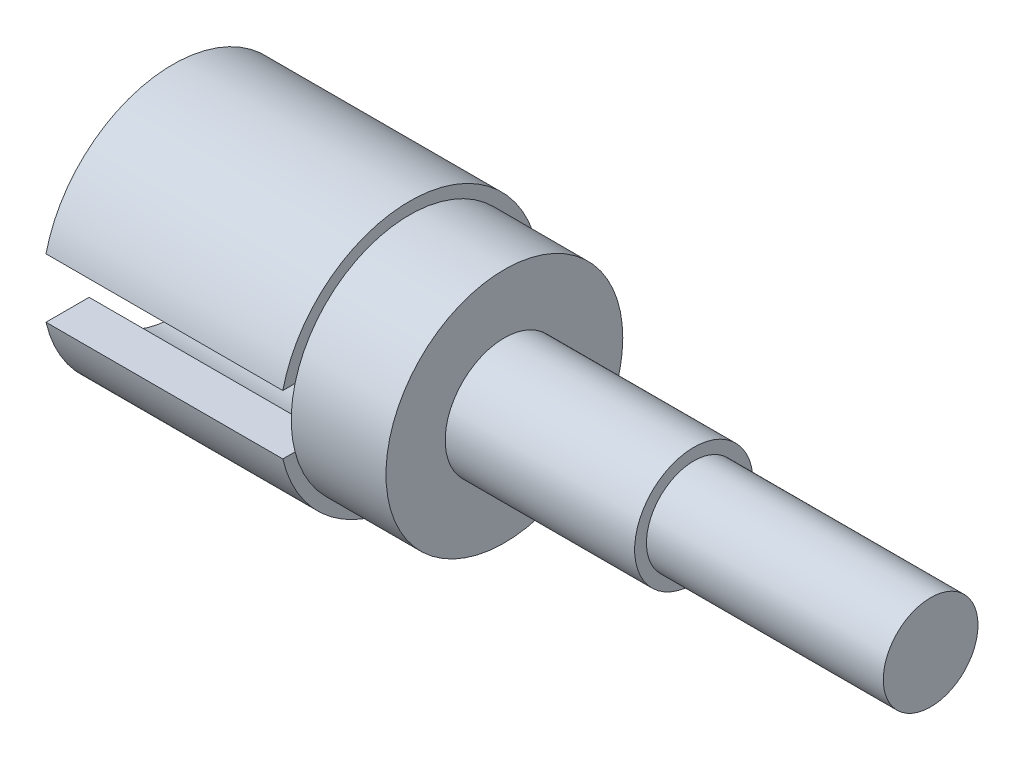
ISO-10303-21;
HEADER;
FILE_DESCRIPTION(('STEP AP214'),'2;1');
FILE_NAME('part.step','',(''),(''),'','','');
FILE_SCHEMA(('AUTOMOTIVE_DESIGN { 1 0 10303 214 1 1 1 1 }'));
ENDSEC;
DATA;
#1=APPLICATION_CONTEXT('core data for automotive mechanical design processes');
#2=APPLICATION_PROTOCOL_DEFINITION('international standard','automotive_design',2000,#1);
#3=PRODUCT_CONTEXT('',#1,'mechanical');
#4=PRODUCT('Part','Part','',(#3));
#5=PRODUCT_RELATED_PRODUCT_CATEGORY('part','',(#4));
#6=PRODUCT_DEFINITION_FORMATION('','',#4);
#7=PRODUCT_DEFINITION_CONTEXT('part definition',#1,'design');
#8=PRODUCT_DEFINITION('design','',#6,#7);
#9=PRODUCT_DEFINITION_SHAPE('','',#8);
#10=(LENGTH_UNIT() NAMED_UNIT(*) SI_UNIT(.MILLI.,.METRE.));
#11=(NAMED_UNIT(*) PLANE_ANGLE_UNIT() SI_UNIT($,.RADIAN.));
#12=(NAMED_UNIT(*) SI_UNIT($,.STERADIAN.) SOLID_ANGLE_UNIT());
#13=UNCERTAINTY_MEASURE_WITH_UNIT(LENGTH_MEASURE(1.E-05),#10,'distance_accuracy_value','');
#14=(GEOMETRIC_REPRESENTATION_CONTEXT(3) GLOBAL_UNCERTAINTY_ASSIGNED_CONTEXT((#13)) GLOBAL_UNIT_ASSIGNED_CONTEXT((#10,
#11,#12)) REPRESENTATION_CONTEXT('',''));
#15=CARTESIAN_POINT('',(0.,0.,0.));
#16=DIRECTION('',(0.,0.,1.));
#17=DIRECTION('',(1.,0.,0.));
#18=AXIS2_PLACEMENT_3D('',#15,#16,#17);
#19=CARTESIAN_POINT('',(10.,0.,0.));
#20=DIRECTION('',(-1.,0.,0.));
#21=DIRECTION('',(0.,0.,1.));
#22=AXIS2_PLACEMENT_3D('',#19,#20,#21);
#23=CYLINDRICAL_SURFACE('',#22,5.5);
#24=CARTESIAN_POINT('',(10.,0.,0.));
#25=DIRECTION('',(1.,0.,0.));
#26=DIRECTION('',(0.,0.,-1.));
#27=AXIS2_PLACEMENT_3D('',#24,#25,#26);
#28=CIRCLE('',#27,5.5);
#29=CARTESIAN_POINT('',(10.,1.25,-5.35607132140714));
#30=VERTEX_POINT('',#29);
#31=CARTESIAN_POINT('',(10.,1.25,5.35607132140713));
#32=VERTEX_POINT('',#31);
#33=EDGE_CURVE('E141',#30,#32,#28,.T.);
#34=ORIENTED_EDGE('',*,*,#33,.F.);
#35=DIRECTION('',(-1.,0.,0.));
#36=VECTOR('',#35,1.);
#37=CARTESIAN_POINT('',(10.,1.25,-5.35607132140714));
#38=LINE('',#37,#36);
#39=CARTESIAN_POINT('',(0.,1.25,-5.35607132140714));
#40=VERTEX_POINT('',#39);
#41=EDGE_CURVE('E183',#30,#40,#38,.T.);
#42=ORIENTED_EDGE('',*,*,#41,.T.);
#43=CARTESIAN_POINT('',(0.,0.,0.));
#44=DIRECTION('',(1.,0.,0.));
#45=DIRECTION('',(0.,0.,-1.));
#46=AXIS2_PLACEMENT_3D('',#43,#44,#45);
#47=CIRCLE('',#46,5.5);
#48=CARTESIAN_POINT('',(0.,1.25,5.35607132140713));
#49=VERTEX_POINT('',#48);
#50=EDGE_CURVE('E132',#40,#49,#47,.T.);
#51=ORIENTED_EDGE('',*,*,#50,.T.);
#52=DIRECTION('',(-1.,0.,0.));
#53=VECTOR('',#52,1.);
#54=CARTESIAN_POINT('',(10.,1.25,5.35607132140714));
#55=LINE('',#54,#53);
#56=EDGE_CURVE('E180',#49,#32,#55,.F.);
#57=ORIENTED_EDGE('',*,*,#56,.T.);
#58=EDGE_LOOP('',(#34,#42,#51,#57));
#59=FACE_BOUND('',#58,.T.);
#60=ADVANCED_FACE('F33',(#59),#23,.T.);
#61=CARTESIAN_POINT('',(10.,0.,0.));
#62=DIRECTION('',(1.,0.,0.));
#63=DIRECTION('',(0.,0.,-1.));
#64=AXIS2_PLACEMENT_3D('',#61,#62,#63);
#65=PLANE('',#64);
#66=DIRECTION('',(0.,0.,-1.));
#67=VECTOR('',#66,1.);
#68=CARTESIAN_POINT('',(10.,1.25,-11.0703271265606));
#69=LINE('',#68,#67);
#70=CARTESIAN_POINT('',(10.,1.25,-4.84122918275927));
#71=VERTEX_POINT('',#70);
#72=EDGE_CURVE('E163',#71,#30,#69,.T.);
#73=ORIENTED_EDGE('',*,*,#72,.T.);
#74=ORIENTED_EDGE('',*,*,#33,.T.);
#75=CARTESIAN_POINT('',(10.,1.25,4.84122918275927));
#76=VERTEX_POINT('',#75);
#77=EDGE_CURVE('E165',#32,#76,#69,.T.);
#78=ORIENTED_EDGE('',*,*,#77,.T.);
#79=CARTESIAN_POINT('',(10.,0.,0.));
#80=DIRECTION('',(1.,0.,0.));
#81=DIRECTION('',(0.,0.,-1.));
#82=AXIS2_PLACEMENT_3D('',#79,#80,#81);
#83=CIRCLE('',#82,5.);
#84=EDGE_CURVE('E138',#71,#76,#83,.T.);
#85=ORIENTED_EDGE('',*,*,#84,.F.);
#86=EDGE_LOOP('',(#73,#74,#78,#85));
#87=FACE_BOUND('',#86,.T.);
#88=ADVANCED_FACE('F238',(#87),#65,.T.);
#89=CARTESIAN_POINT('',(0.,0.,0.));
#90=DIRECTION('',(1.,0.,0.));
#91=DIRECTION('',(0.,0.,-1.));
#92=AXIS2_PLACEMENT_3D('',#89,#90,#91);
#93=PLANE('',#92);
#94=ORIENTED_EDGE('',*,*,#50,.F.);
#95=DIRECTION('',(0.,0.,-1.));
#96=VECTOR('',#95,1.);
#97=CARTESIAN_POINT('',(0.,1.25,-11.0703271265606));
#98=LINE('',#97,#96);
#99=CARTESIAN_POINT('',(0.,1.25,-3.53553390593274));
#100=VERTEX_POINT('',#99);
#101=EDGE_CURVE('E128',#100,#40,#98,.T.);
#102=ORIENTED_EDGE('',*,*,#101,.F.);
#103=CARTESIAN_POINT('',(0.,0.,0.));
#104=DIRECTION('',(-1.,0.,0.));
#105=DIRECTION('',(0.,0.,1.));
#106=AXIS2_PLACEMENT_3D('',#103,#104,#105);
#107=CIRCLE('',#106,3.75);
#108=CARTESIAN_POINT('',(0.,1.25,3.53553390593274));
#109=VERTEX_POINT('',#108);
#110=EDGE_CURVE('E191',#109,#100,#107,.T.);
#111=ORIENTED_EDGE('',*,*,#110,.F.);
#112=EDGE_CURVE('E159',#49,#109,#98,.T.);
#113=ORIENTED_EDGE('',*,*,#112,.F.);
#114=EDGE_LOOP('',(#94,#102,#111,#113));
#115=FACE_BOUND('',#114,.T.);
#116=ADVANCED_FACE('F218',(#115),#93,.F.);
#117=CARTESIAN_POINT('',(9.,0.,0.));
#118=DIRECTION('',(-1.,0.,0.));
#119=DIRECTION('',(0.,0.,1.));
#120=AXIS2_PLACEMENT_3D('',#117,#118,#119);
#121=CYLINDRICAL_SURFACE('',#120,3.75);
#122=ORIENTED_EDGE('',*,*,#110,.T.);
#123=DIRECTION('',(-1.,0.,0.));
#124=VECTOR('',#123,1.);
#125=CARTESIAN_POINT('',(9.,1.25,-3.53553390593274));
#126=LINE('',#125,#124);
#127=CARTESIAN_POINT('',(9.,1.25,-3.53553390593274));
#128=VERTEX_POINT('',#127);
#129=EDGE_CURVE('E178',#100,#128,#126,.F.);
#130=ORIENTED_EDGE('',*,*,#129,.T.);
#131=CARTESIAN_POINT('',(9.,0.,0.));
#132=DIRECTION('',(-1.,0.,0.));
#133=DIRECTION('',(0.,0.,1.));
#134=AXIS2_PLACEMENT_3D('',#131,#132,#133);
#135=CIRCLE('',#134,3.75);
#136=CARTESIAN_POINT('',(9.,1.25,3.53553390593274));
#137=VERTEX_POINT('',#136);
#138=EDGE_CURVE('E186',#137,#128,#135,.T.);
#139=ORIENTED_EDGE('',*,*,#138,.F.);
#140=DIRECTION('',(-1.,0.,0.));
#141=VECTOR('',#140,1.);
#142=CARTESIAN_POINT('',(9.,1.25,3.53553390593274));
#143=LINE('',#142,#141);
#144=EDGE_CURVE('E175',#137,#109,#143,.T.);
#145=ORIENTED_EDGE('',*,*,#144,.T.);
#146=EDGE_LOOP('',(#122,#130,#139,#145));
#147=FACE_BOUND('',#146,.T.);
#148=ADVANCED_FACE('F222',(#147),#121,.F.);
#149=CARTESIAN_POINT('',(9.,0.,0.));
#150=DIRECTION('',(-1.,0.,0.));
#151=DIRECTION('',(0.,0.,1.));
#152=AXIS2_PLACEMENT_3D('',#149,#150,#151);
#153=PLANE('',#152);
#154=DIRECTION('',(0.,0.,-1.));
#155=VECTOR('',#154,1.);
#156=CARTESIAN_POINT('',(9.,1.25,0.));
#157=LINE('',#156,#155);
#158=EDGE_CURVE('E11',#137,#128,#157,.T.);
#159=ORIENTED_EDGE('',*,*,#158,.F.);
#160=ORIENTED_EDGE('',*,*,#138,.T.);
#161=EDGE_LOOP('',(#159,#160));
#162=FACE_BOUND('',#161,.T.);
#163=ADVANCED_FACE('F224',(#162),#153,.T.);
#164=CARTESIAN_POINT('',(10.,-1.25,5.35607132140713));
#165=VERTEX_POINT('',#164);
#166=CARTESIAN_POINT('',(10.,-1.25,-5.35607132140714));
#167=VERTEX_POINT('',#166);
#168=EDGE_CURVE('E136',#165,#167,#28,.T.);
#169=ORIENTED_EDGE('',*,*,#168,.F.);
#170=DIRECTION('',(-1.,0.,0.));
#171=VECTOR('',#170,1.);
#172=CARTESIAN_POINT('',(10.,-1.25,5.35607132140714));
#173=LINE('',#172,#171);
#174=CARTESIAN_POINT('',(0.,-1.25,5.35607132140713));
#175=VERTEX_POINT('',#174);
#176=EDGE_CURVE('E117',#165,#175,#173,.T.);
#177=ORIENTED_EDGE('',*,*,#176,.T.);
#178=CARTESIAN_POINT('',(0.,-1.25,-5.35607132140714));
#179=VERTEX_POINT('',#178);
#180=EDGE_CURVE('E125',#175,#179,#47,.T.);
#181=ORIENTED_EDGE('',*,*,#180,.T.);
#182=DIRECTION('',(-1.,0.,0.));
#183=VECTOR('',#182,1.);
#184=CARTESIAN_POINT('',(10.,-1.25,-5.35607132140714));
#185=LINE('',#184,#183);
#186=EDGE_CURVE('E106',#179,#167,#185,.F.);
#187=ORIENTED_EDGE('',*,*,#186,.T.);
#188=EDGE_LOOP('',(#169,#177,#181,#187));
#189=FACE_BOUND('',#188,.T.);
#190=ADVANCED_FACE('F35',(#189),#23,.T.);
#191=DIRECTION('',(0.,0.,1.));
#192=VECTOR('',#191,1.);
#193=CARTESIAN_POINT('',(10.,-1.25,-11.0703271265606));
#194=LINE('',#193,#192);
#195=CARTESIAN_POINT('',(10.,-1.25,4.84122918275927));
#196=VERTEX_POINT('',#195);
#197=EDGE_CURVE('E154',#196,#165,#194,.T.);
#198=ORIENTED_EDGE('',*,*,#197,.T.);
#199=ORIENTED_EDGE('',*,*,#168,.T.);
#200=CARTESIAN_POINT('',(10.,-1.25,-4.84122918275927));
#201=VERTEX_POINT('',#200);
#202=EDGE_CURVE('E112',#167,#201,#194,.T.);
#203=ORIENTED_EDGE('',*,*,#202,.T.);
#204=EDGE_CURVE('E155',#196,#201,#83,.T.);
#205=ORIENTED_EDGE('',*,*,#204,.F.);
#206=EDGE_LOOP('',(#198,#199,#203,#205));
#207=FACE_BOUND('',#206,.T.);
#208=ADVANCED_FACE('F151',(#207),#65,.T.);
#209=ORIENTED_EDGE('',*,*,#180,.F.);
#210=DIRECTION('',(0.,0.,1.));
#211=VECTOR('',#210,1.);
#212=CARTESIAN_POINT('',(0.,-1.25,-11.0703271265606));
#213=LINE('',#212,#211);
#214=CARTESIAN_POINT('',(0.,-1.25,3.53553390593274));
#215=VERTEX_POINT('',#214);
#216=EDGE_CURVE('E129',#215,#175,#213,.T.);
#217=ORIENTED_EDGE('',*,*,#216,.F.);
#218=CARTESIAN_POINT('',(0.,-1.25,-3.53553390593274));
#219=VERTEX_POINT('',#218);
#220=EDGE_CURVE('E127',#219,#215,#107,.T.);
#221=ORIENTED_EDGE('',*,*,#220,.F.);
#222=EDGE_CURVE('E109',#179,#219,#213,.T.);
#223=ORIENTED_EDGE('',*,*,#222,.F.);
#224=EDGE_LOOP('',(#209,#217,#221,#223));
#225=FACE_BOUND('',#224,.T.);
#226=ADVANCED_FACE('F123',(#225),#93,.F.);
#227=CARTESIAN_POINT('',(14.,0.,0.));
#228=DIRECTION('',(-1.,0.,0.));
#229=DIRECTION('',(0.,0.,1.));
#230=AXIS2_PLACEMENT_3D('',#227,#228,#229);
#231=CYLINDRICAL_SURFACE('',#230,5.);
#232=CARTESIAN_POINT('',(14.,0.,0.));
#233=DIRECTION('',(1.,0.,0.));
#234=DIRECTION('',(0.,0.,-1.));
#235=AXIS2_PLACEMENT_3D('',#232,#233,#234);
#236=CIRCLE('',#235,5.);
#237=CARTESIAN_POINT('',(14.,0.,-5.));
#238=VERTEX_POINT('',#237);
#239=EDGE_CURVE('E133',#238,#238,#236,.T.);
#240=ORIENTED_EDGE('',*,*,#239,.F.);
#241=EDGE_LOOP('',(#240));
#242=FACE_BOUND('',#241,.T.);
#243=ORIENTED_EDGE('',*,*,#84,.T.);
#244=EDGE_CURVE('E205',#76,#196,#83,.T.);
#245=ORIENTED_EDGE('',*,*,#244,.T.);
#246=ORIENTED_EDGE('',*,*,#204,.T.);
#247=EDGE_CURVE('E203',#201,#71,#83,.T.);
#248=ORIENTED_EDGE('',*,*,#247,.T.);
#249=EDGE_LOOP('',(#243,#245,#246,#248));
#250=FACE_BOUND('',#249,.T.);
#251=ADVANCED_FACE('F208',(#242,#250),#231,.T.);
#252=CARTESIAN_POINT('',(14.,0.,0.));
#253=DIRECTION('',(1.,0.,0.));
#254=DIRECTION('',(0.,0.,-1.));
#255=AXIS2_PLACEMENT_3D('',#252,#253,#254);
#256=PLANE('',#255);
#257=CARTESIAN_POINT('',(14.,0.,0.));
#258=DIRECTION('',(1.,0.,0.));
#259=DIRECTION('',(0.,0.,-1.));
#260=AXIS2_PLACEMENT_3D('',#257,#258,#259);
#261=CIRCLE('',#260,2.5);
#262=CARTESIAN_POINT('',(14.,0.,-2.5));
#263=VERTEX_POINT('',#262);
#264=EDGE_CURVE('E197',#263,#263,#261,.T.);
#265=ORIENTED_EDGE('',*,*,#264,.F.);
#266=EDGE_LOOP('',(#265));
#267=FACE_BOUND('',#266,.T.);
#268=ORIENTED_EDGE('',*,*,#239,.T.);
#269=EDGE_LOOP('',(#268));
#270=FACE_BOUND('',#269,.T.);
#271=ADVANCED_FACE('F255',(#267,#270),#256,.T.);
#272=CARTESIAN_POINT('',(22.,0.,0.));
#273=DIRECTION('',(-1.,0.,0.));
#274=DIRECTION('',(0.,0.,1.));
#275=AXIS2_PLACEMENT_3D('',#272,#273,#274);
#276=CYLINDRICAL_SURFACE('',#275,2.5);
#277=CARTESIAN_POINT('',(22.,0.,0.));
#278=DIRECTION('',(1.,0.,0.));
#279=DIRECTION('',(0.,0.,-1.));
#280=AXIS2_PLACEMENT_3D('',#277,#278,#279);
#281=CIRCLE('',#280,2.5);
#282=CARTESIAN_POINT('',(22.,0.,-2.5));
#283=VERTEX_POINT('',#282);
#284=EDGE_CURVE('E200',#283,#283,#281,.T.);
#285=ORIENTED_EDGE('',*,*,#284,.F.);
#286=EDGE_LOOP('',(#285));
#287=FACE_BOUND('',#286,.T.);
#288=ORIENTED_EDGE('',*,*,#264,.T.);
#289=EDGE_LOOP('',(#288));
#290=FACE_BOUND('',#289,.T.);
#291=ADVANCED_FACE('F261',(#287,#290),#276,.T.);
#292=CARTESIAN_POINT('',(22.,0.,0.));
#293=DIRECTION('',(1.,0.,0.));
#294=DIRECTION('',(0.,0.,-1.));
#295=AXIS2_PLACEMENT_3D('',#292,#293,#294);
#296=PLANE('',#295);
#297=CARTESIAN_POINT('',(22.,0.,0.));
#298=DIRECTION('',(1.,0.,0.));
#299=DIRECTION('',(0.,0.,-1.));
#300=AXIS2_PLACEMENT_3D('',#297,#298,#299);
#301=CIRCLE('',#300,2.);
#302=CARTESIAN_POINT('',(22.,0.,-2.));
#303=VERTEX_POINT('',#302);
#304=EDGE_CURVE('E189',#303,#303,#301,.T.);
#305=ORIENTED_EDGE('',*,*,#304,.F.);
#306=EDGE_LOOP('',(#305));
#307=FACE_BOUND('',#306,.T.);
#308=ORIENTED_EDGE('',*,*,#284,.T.);
#309=EDGE_LOOP('',(#308));
#310=FACE_BOUND('',#309,.T.);
#311=ADVANCED_FACE('F268',(#307,#310),#296,.T.);
#312=CARTESIAN_POINT('',(32.,0.,0.));
#313=DIRECTION('',(-1.,0.,0.));
#314=DIRECTION('',(0.,0.,1.));
#315=AXIS2_PLACEMENT_3D('',#312,#313,#314);
#316=CYLINDRICAL_SURFACE('',#315,2.);
#317=CARTESIAN_POINT('',(32.,0.,0.));
#318=DIRECTION('',(1.,0.,0.));
#319=DIRECTION('',(0.,0.,-1.));
#320=AXIS2_PLACEMENT_3D('',#317,#318,#319);
#321=CIRCLE('',#320,2.);
#322=CARTESIAN_POINT('',(32.,0.,-2.));
#323=VERTEX_POINT('',#322);
#324=EDGE_CURVE('E194',#323,#323,#321,.T.);
#325=ORIENTED_EDGE('',*,*,#324,.F.);
#326=EDGE_LOOP('',(#325));
#327=FACE_BOUND('',#326,.T.);
#328=ORIENTED_EDGE('',*,*,#304,.T.);
#329=EDGE_LOOP('',(#328));
#330=FACE_BOUND('',#329,.T.);
#331=ADVANCED_FACE('F272',(#327,#330),#316,.T.);
#332=CARTESIAN_POINT('',(32.,0.,0.));
#333=DIRECTION('',(1.,0.,0.));
#334=DIRECTION('',(0.,0.,-1.));
#335=AXIS2_PLACEMENT_3D('',#332,#333,#334);
#336=PLANE('',#335);
#337=ORIENTED_EDGE('',*,*,#324,.T.);
#338=EDGE_LOOP('',(#337));
#339=FACE_BOUND('',#338,.T.);
#340=ADVANCED_FACE('F276',(#339),#336,.T.);
#341=ORIENTED_EDGE('',*,*,#220,.T.);
#342=DIRECTION('',(-1.,0.,0.));
#343=VECTOR('',#342,1.);
#344=CARTESIAN_POINT('',(9.,-1.25,3.53553390593274));
#345=LINE('',#344,#343);
#346=CARTESIAN_POINT('',(9.,-1.25,3.53553390593274));
#347=VERTEX_POINT('',#346);
#348=EDGE_CURVE('E118',#215,#347,#345,.F.);
#349=ORIENTED_EDGE('',*,*,#348,.T.);
#350=CARTESIAN_POINT('',(9.,-1.25,-3.53553390593274));
#351=VERTEX_POINT('',#350);
#352=EDGE_CURVE('E190',#351,#347,#135,.T.);
#353=ORIENTED_EDGE('',*,*,#352,.F.);
#354=DIRECTION('',(-1.,0.,0.));
#355=VECTOR('',#354,1.);
#356=CARTESIAN_POINT('',(9.,-1.25,-3.53553390593274));
#357=LINE('',#356,#355);
#358=EDGE_CURVE('E48',#351,#219,#357,.T.);
#359=ORIENTED_EDGE('',*,*,#358,.T.);
#360=EDGE_LOOP('',(#341,#349,#353,#359));
#361=FACE_BOUND('',#360,.T.);
#362=ADVANCED_FACE('F233',(#361),#121,.F.);
#363=DIRECTION('',(0.,0.,1.));
#364=VECTOR('',#363,1.);
#365=CARTESIAN_POINT('',(9.,-1.25,0.));
#366=LINE('',#365,#364);
#367=EDGE_CURVE('E41',#351,#347,#366,.T.);
#368=ORIENTED_EDGE('',*,*,#367,.F.);
#369=ORIENTED_EDGE('',*,*,#352,.T.);
#370=EDGE_LOOP('',(#368,#369));
#371=FACE_BOUND('',#370,.T.);
#372=ADVANCED_FACE('F227',(#371),#153,.T.);
#373=CARTESIAN_POINT('',(10.,0.,0.));
#374=DIRECTION('',(1.,0.,0.));
#375=DIRECTION('',(0.,0.,-1.));
#376=AXIS2_PLACEMENT_3D('',#373,#374,#375);
#377=PLANE('',#376);
#378=EDGE_CURVE('E164',#76,#71,#69,.T.);
#379=ORIENTED_EDGE('',*,*,#378,.T.);
#380=ORIENTED_EDGE('',*,*,#247,.F.);
#381=EDGE_CURVE('E158',#201,#196,#194,.T.);
#382=ORIENTED_EDGE('',*,*,#381,.T.);
#383=ORIENTED_EDGE('',*,*,#244,.F.);
#384=EDGE_LOOP('',(#379,#380,#382,#383));
#385=FACE_BOUND('',#384,.T.);
#386=ADVANCED_FACE('F211',(#385),#377,.F.);
#387=CARTESIAN_POINT('',(10.,1.25,-11.0703271265606));
#388=DIRECTION('',(0.,1.,0.));
#389=DIRECTION('',(0.,0.,1.));
#390=AXIS2_PLACEMENT_3D('',#387,#388,#389);
#391=PLANE('',#390);
#392=ORIENTED_EDGE('',*,*,#72,.F.);
#393=ORIENTED_EDGE('',*,*,#378,.F.);
#394=ORIENTED_EDGE('',*,*,#77,.F.);
#395=ORIENTED_EDGE('',*,*,#56,.F.);
#396=ORIENTED_EDGE('',*,*,#112,.T.);
#397=ORIENTED_EDGE('',*,*,#144,.F.);
#398=ORIENTED_EDGE('',*,*,#158,.T.);
#399=ORIENTED_EDGE('',*,*,#129,.F.);
#400=ORIENTED_EDGE('',*,*,#101,.T.);
#401=ORIENTED_EDGE('',*,*,#41,.F.);
#402=EDGE_LOOP('',(#392,#393,#394,#395,#396,#397,#398,#399,#400,#401));
#403=FACE_BOUND('',#402,.T.);
#404=ADVANCED_FACE('F212',(#403),#391,.F.);
#405=CARTESIAN_POINT('',(10.,-1.25,-11.0703271265606));
#406=DIRECTION('',(0.,-1.,0.));
#407=DIRECTION('',(0.,0.,-1.));
#408=AXIS2_PLACEMENT_3D('',#405,#406,#407);
#409=PLANE('',#408);
#410=ORIENTED_EDGE('',*,*,#197,.F.);
#411=ORIENTED_EDGE('',*,*,#381,.F.);
#412=ORIENTED_EDGE('',*,*,#202,.F.);
#413=ORIENTED_EDGE('',*,*,#186,.F.);
#414=ORIENTED_EDGE('',*,*,#222,.T.);
#415=ORIENTED_EDGE('',*,*,#358,.F.);
#416=ORIENTED_EDGE('',*,*,#367,.T.);
#417=ORIENTED_EDGE('',*,*,#348,.F.);
#418=ORIENTED_EDGE('',*,*,#216,.T.);
#419=ORIENTED_EDGE('',*,*,#176,.F.);
#420=EDGE_LOOP('',(#410,#411,#412,#413,#414,#415,#416,#417,#418,#419));
#421=FACE_BOUND('',#420,.T.);
#422=ADVANCED_FACE('F108',(#421),#409,.F.);
#423=CLOSED_SHELL('',(#60,#88,#116,#148,#163,#190,#208,#226,#251,#271,#291,#311,#331,#340,#362,
#372,#386,#404,#422));
#424=MANIFOLD_SOLID_BREP('B2',#423);
#425=ADVANCED_BREP_SHAPE_REPRESENTATION('',(#18,#424),#14);
#426=SHAPE_DEFINITION_REPRESENTATION(#9,#425);
ENDSEC;
END-ISO-10303-21;
